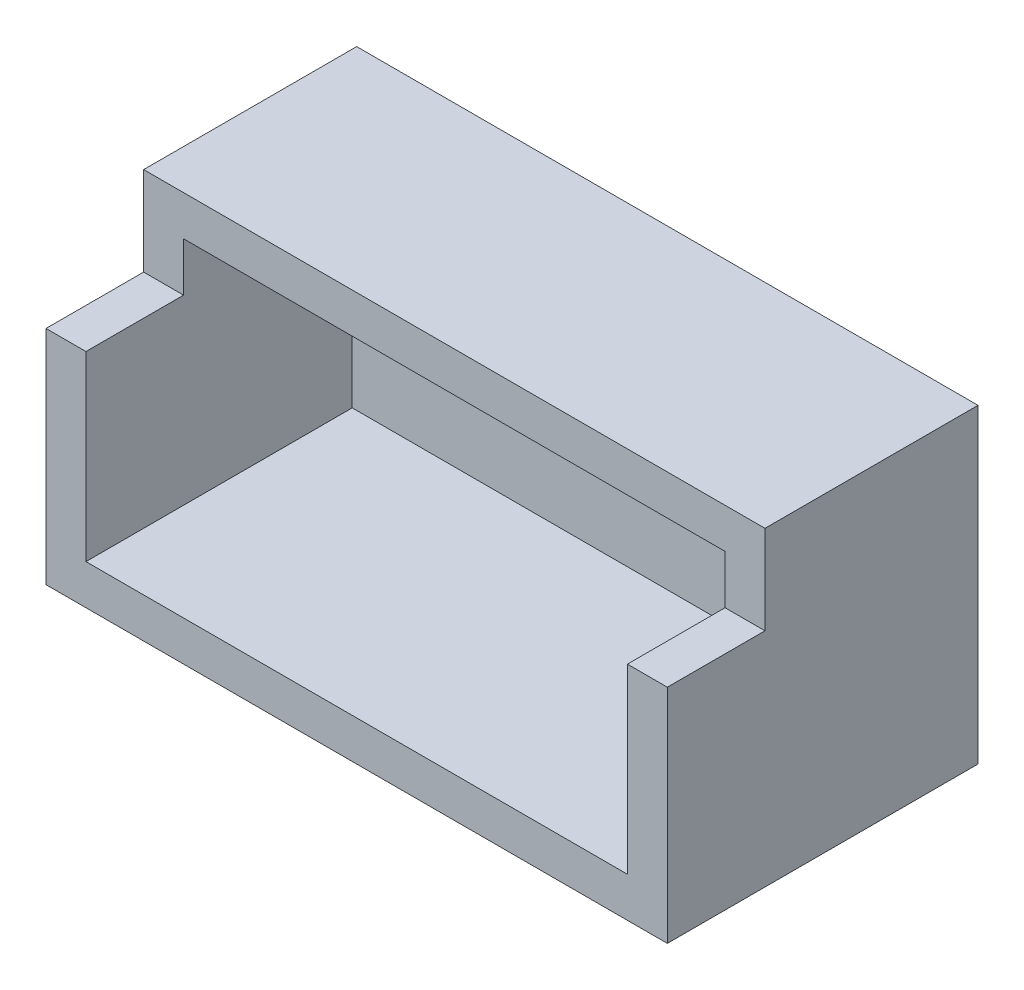
ISO-10303-21;
HEADER;
FILE_DESCRIPTION(('STEP AP214'),'2;1');
FILE_NAME('part.step','',(''),(''),'','','');
FILE_SCHEMA(('AUTOMOTIVE_DESIGN { 1 0 10303 214 1 1 1 1 }'));
ENDSEC;
DATA;
#1=APPLICATION_CONTEXT('core data for automotive mechanical design processes');
#2=APPLICATION_PROTOCOL_DEFINITION('international standard','automotive_design',2000,#1);
#3=PRODUCT_CONTEXT('',#1,'mechanical');
#4=PRODUCT('Part','Part','',(#3));
#5=PRODUCT_RELATED_PRODUCT_CATEGORY('part','',(#4));
#6=PRODUCT_DEFINITION_FORMATION('','',#4);
#7=PRODUCT_DEFINITION_CONTEXT('part definition',#1,'design');
#8=PRODUCT_DEFINITION('design','',#6,#7);
#9=PRODUCT_DEFINITION_SHAPE('','',#8);
#10=(LENGTH_UNIT() NAMED_UNIT(*) SI_UNIT(.MILLI.,.METRE.));
#11=(NAMED_UNIT(*) PLANE_ANGLE_UNIT() SI_UNIT($,.RADIAN.));
#12=(NAMED_UNIT(*) SI_UNIT($,.STERADIAN.) SOLID_ANGLE_UNIT());
#13=UNCERTAINTY_MEASURE_WITH_UNIT(LENGTH_MEASURE(1.E-05),#10,'distance_accuracy_value','');
#14=(GEOMETRIC_REPRESENTATION_CONTEXT(3) GLOBAL_UNCERTAINTY_ASSIGNED_CONTEXT((#13)) GLOBAL_UNIT_ASSIGNED_CONTEXT((#10,
#11,#12)) REPRESENTATION_CONTEXT('',''));
#15=CARTESIAN_POINT('',(0.,0.,0.));
#16=DIRECTION('',(0.,0.,1.));
#17=DIRECTION('',(1.,0.,0.));
#18=AXIS2_PLACEMENT_3D('',#15,#16,#17);
#19=CARTESIAN_POINT('',(0.,0.,6.));
#20=DIRECTION('',(0.,0.,-1.));
#21=DIRECTION('',(-1.,0.,0.));
#22=AXIS2_PLACEMENT_3D('',#19,#20,#21);
#23=PLANE('',#22);
#24=DIRECTION('',(1.,0.,0.));
#25=VECTOR('',#24,1.);
#26=CARTESIAN_POINT('',(0.,-16.,6.));
#27=LINE('',#26,#25);
#28=CARTESIAN_POINT('',(14.,-16.,6.));
#29=VERTEX_POINT('',#28);
#30=CARTESIAN_POINT('',(14.9,-16.,6.));
#31=VERTEX_POINT('',#30);
#32=EDGE_CURVE('E174',#29,#31,#27,.T.);
#33=ORIENTED_EDGE('',*,*,#32,.F.);
#34=DIRECTION('',(0.,-1.,0.));
#35=VECTOR('',#34,1.);
#36=CARTESIAN_POINT('',(14.,-21.,6.));
#37=LINE('',#36,#35);
#38=CARTESIAN_POINT('',(14.,-21.,6.));
#39=VERTEX_POINT('',#38);
#40=EDGE_CURVE('E109',#29,#39,#37,.T.);
#41=ORIENTED_EDGE('',*,*,#40,.T.);
#42=DIRECTION('',(1.,0.,0.));
#43=VECTOR('',#42,1.);
#44=CARTESIAN_POINT('',(14.,-21.,6.));
#45=LINE('',#44,#43);
#46=CARTESIAN_POINT('',(28.,-21.,6.));
#47=VERTEX_POINT('',#46);
#48=EDGE_CURVE('E68',#39,#47,#45,.T.);
#49=ORIENTED_EDGE('',*,*,#48,.T.);
#50=DIRECTION('',(0.,1.,0.));
#51=VECTOR('',#50,1.);
#52=CARTESIAN_POINT('',(28.,-21.,6.));
#53=LINE('',#52,#51);
#54=CARTESIAN_POINT('',(28.,-16.,6.));
#55=VERTEX_POINT('',#54);
#56=EDGE_CURVE('E101',#47,#55,#53,.T.);
#57=ORIENTED_EDGE('',*,*,#56,.T.);
#58=CARTESIAN_POINT('',(27.1,-16.,6.));
#59=VERTEX_POINT('',#58);
#60=EDGE_CURVE('E166',#59,#55,#27,.T.);
#61=ORIENTED_EDGE('',*,*,#60,.F.);
#62=DIRECTION('',(0.,1.,0.));
#63=VECTOR('',#62,1.);
#64=CARTESIAN_POINT('',(27.1,0.,6.));
#65=LINE('',#64,#63);
#66=CARTESIAN_POINT('',(27.1,-20.1,6.));
#67=VERTEX_POINT('',#66);
#68=EDGE_CURVE('E135',#67,#59,#65,.T.);
#69=ORIENTED_EDGE('',*,*,#68,.F.);
#70=DIRECTION('',(1.,0.,0.));
#71=VECTOR('',#70,1.);
#72=CARTESIAN_POINT('',(0.,-20.1,6.));
#73=LINE('',#72,#71);
#74=CARTESIAN_POINT('',(14.9,-20.1,6.));
#75=VERTEX_POINT('',#74);
#76=EDGE_CURVE('E133',#75,#67,#73,.T.);
#77=ORIENTED_EDGE('',*,*,#76,.F.);
#78=DIRECTION('',(0.,-1.,0.));
#79=VECTOR('',#78,1.);
#80=CARTESIAN_POINT('',(14.9,0.,6.));
#81=LINE('',#80,#79);
#82=EDGE_CURVE('E139',#31,#75,#81,.T.);
#83=ORIENTED_EDGE('',*,*,#82,.F.);
#84=EDGE_LOOP('',(#33,#41,#49,#57,#61,#69,#77,#83));
#85=FACE_BOUND('',#84,.T.);
#86=ADVANCED_FACE('F43',(#85),#23,.F.);
#87=CARTESIAN_POINT('',(14.,-21.,6.));
#88=DIRECTION('',(1.,0.,0.));
#89=DIRECTION('',(0.,0.,-1.));
#90=AXIS2_PLACEMENT_3D('',#87,#88,#89);
#91=PLANE('',#90);
#92=DIRECTION('',(0.,0.,1.));
#93=VECTOR('',#92,1.);
#94=CARTESIAN_POINT('',(14.,-16.,6.));
#95=LINE('',#94,#93);
#96=CARTESIAN_POINT('',(14.,-16.,3.8));
#97=VERTEX_POINT('',#96);
#98=EDGE_CURVE('E178',#97,#29,#95,.T.);
#99=ORIENTED_EDGE('',*,*,#98,.F.);
#100=DIRECTION('',(0.,1.,0.));
#101=VECTOR('',#100,1.);
#102=CARTESIAN_POINT('',(14.,-21.,3.8));
#103=LINE('',#102,#101);
#104=CARTESIAN_POINT('',(14.,-14.,3.8));
#105=VERTEX_POINT('',#104);
#106=EDGE_CURVE('E100',#97,#105,#103,.T.);
#107=ORIENTED_EDGE('',*,*,#106,.T.);
#108=DIRECTION('',(0.,0.,-1.));
#109=VECTOR('',#108,1.);
#110=CARTESIAN_POINT('',(14.,-14.,6.));
#111=LINE('',#110,#109);
#112=CARTESIAN_POINT('',(14.,-14.,-1.));
#113=VERTEX_POINT('',#112);
#114=EDGE_CURVE('E90',#105,#113,#111,.T.);
#115=ORIENTED_EDGE('',*,*,#114,.T.);
#116=DIRECTION('',(0.,-1.,0.));
#117=VECTOR('',#116,1.);
#118=CARTESIAN_POINT('',(14.,-21.,-1.));
#119=LINE('',#118,#117);
#120=CARTESIAN_POINT('',(14.,-21.,-1.));
#121=VERTEX_POINT('',#120);
#122=EDGE_CURVE('E94',#113,#121,#119,.T.);
#123=ORIENTED_EDGE('',*,*,#122,.T.);
#124=DIRECTION('',(0.,0.,-1.));
#125=VECTOR('',#124,1.);
#126=CARTESIAN_POINT('',(14.,-21.,6.));
#127=LINE('',#126,#125);
#128=EDGE_CURVE('E128',#39,#121,#127,.T.);
#129=ORIENTED_EDGE('',*,*,#128,.F.);
#130=ORIENTED_EDGE('',*,*,#40,.F.);
#131=EDGE_LOOP('',(#99,#107,#115,#123,#129,#130));
#132=FACE_BOUND('',#131,.T.);
#133=ADVANCED_FACE('F44',(#132),#91,.F.);
#134=CARTESIAN_POINT('',(28.,-21.,6.));
#135=DIRECTION('',(-1.,0.,0.));
#136=DIRECTION('',(0.,0.,1.));
#137=AXIS2_PLACEMENT_3D('',#134,#135,#136);
#138=PLANE('',#137);
#139=DIRECTION('',(0.,0.,-1.));
#140=VECTOR('',#139,1.);
#141=CARTESIAN_POINT('',(28.,-16.,6.));
#142=LINE('',#141,#140);
#143=CARTESIAN_POINT('',(28.,-16.,3.8));
#144=VERTEX_POINT('',#143);
#145=EDGE_CURVE('E175',#55,#144,#142,.T.);
#146=ORIENTED_EDGE('',*,*,#145,.F.);
#147=ORIENTED_EDGE('',*,*,#56,.F.);
#148=DIRECTION('',(0.,0.,-1.));
#149=VECTOR('',#148,1.);
#150=CARTESIAN_POINT('',(28.,-21.,6.));
#151=LINE('',#150,#149);
#152=CARTESIAN_POINT('',(28.,-21.,-1.));
#153=VERTEX_POINT('',#152);
#154=EDGE_CURVE('E130',#47,#153,#151,.T.);
#155=ORIENTED_EDGE('',*,*,#154,.T.);
#156=DIRECTION('',(0.,1.,0.));
#157=VECTOR('',#156,1.);
#158=CARTESIAN_POINT('',(28.,-21.,-1.));
#159=LINE('',#158,#157);
#160=CARTESIAN_POINT('',(28.,-14.,-1.));
#161=VERTEX_POINT('',#160);
#162=EDGE_CURVE('E112',#153,#161,#159,.T.);
#163=ORIENTED_EDGE('',*,*,#162,.T.);
#164=DIRECTION('',(0.,0.,-1.));
#165=VECTOR('',#164,1.);
#166=CARTESIAN_POINT('',(28.,-14.,6.));
#167=LINE('',#166,#165);
#168=CARTESIAN_POINT('',(28.,-14.,3.8));
#169=VERTEX_POINT('',#168);
#170=EDGE_CURVE('E99',#169,#161,#167,.T.);
#171=ORIENTED_EDGE('',*,*,#170,.F.);
#172=DIRECTION('',(0.,-1.,0.));
#173=VECTOR('',#172,1.);
#174=CARTESIAN_POINT('',(28.,-21.,3.8));
#175=LINE('',#174,#173);
#176=EDGE_CURVE('E164',#169,#144,#175,.T.);
#177=ORIENTED_EDGE('',*,*,#176,.T.);
#178=EDGE_LOOP('',(#146,#147,#155,#163,#171,#177));
#179=FACE_BOUND('',#178,.T.);
#180=ADVANCED_FACE('F215',(#179),#138,.F.);
#181=CARTESIAN_POINT('',(14.9,-20.1,7.));
#182=DIRECTION('',(1.,0.,0.));
#183=DIRECTION('',(0.,0.,-1.));
#184=AXIS2_PLACEMENT_3D('',#181,#182,#183);
#185=PLANE('',#184);
#186=DIRECTION('',(0.,1.,0.));
#187=VECTOR('',#186,1.);
#188=CARTESIAN_POINT('',(14.9,-20.1,3.8));
#189=LINE('',#188,#187);
#190=CARTESIAN_POINT('',(14.9,-16.,3.8));
#191=VERTEX_POINT('',#190);
#192=CARTESIAN_POINT('',(14.9,-14.9,3.8));
#193=VERTEX_POINT('',#192);
#194=EDGE_CURVE('E58',#191,#193,#189,.T.);
#195=ORIENTED_EDGE('',*,*,#194,.F.);
#196=DIRECTION('',(0.,0.,1.));
#197=VECTOR('',#196,1.);
#198=CARTESIAN_POINT('',(14.9,-16.,7.));
#199=LINE('',#198,#197);
#200=EDGE_CURVE('E176',#191,#31,#199,.T.);
#201=ORIENTED_EDGE('',*,*,#200,.T.);
#202=ORIENTED_EDGE('',*,*,#82,.T.);
#203=DIRECTION('',(0.,0.,-1.));
#204=VECTOR('',#203,1.);
#205=CARTESIAN_POINT('',(14.9,-20.1,7.));
#206=LINE('',#205,#204);
#207=CARTESIAN_POINT('',(14.9,-20.1,0.));
#208=VERTEX_POINT('',#207);
#209=EDGE_CURVE('E117',#75,#208,#206,.T.);
#210=ORIENTED_EDGE('',*,*,#209,.T.);
#211=DIRECTION('',(0.,-1.,0.));
#212=VECTOR('',#211,1.);
#213=CARTESIAN_POINT('',(14.9,-20.1,0.));
#214=LINE('',#213,#212);
#215=CARTESIAN_POINT('',(14.9,-14.9,0.));
#216=VERTEX_POINT('',#215);
#217=EDGE_CURVE('E185',#216,#208,#214,.T.);
#218=ORIENTED_EDGE('',*,*,#217,.F.);
#219=DIRECTION('',(0.,0.,-1.));
#220=VECTOR('',#219,1.);
#221=CARTESIAN_POINT('',(14.9,-14.9,7.));
#222=LINE('',#221,#220);
#223=EDGE_CURVE('E193',#193,#216,#222,.T.);
#224=ORIENTED_EDGE('',*,*,#223,.F.);
#225=EDGE_LOOP('',(#195,#201,#202,#210,#218,#224));
#226=FACE_BOUND('',#225,.T.);
#227=ADVANCED_FACE('F249',(#226),#185,.T.);
#228=CARTESIAN_POINT('',(27.1,-20.1,7.));
#229=DIRECTION('',(-1.,0.,0.));
#230=DIRECTION('',(0.,0.,1.));
#231=AXIS2_PLACEMENT_3D('',#228,#229,#230);
#232=PLANE('',#231);
#233=ORIENTED_EDGE('',*,*,#68,.T.);
#234=DIRECTION('',(0.,0.,-1.));
#235=VECTOR('',#234,1.);
#236=CARTESIAN_POINT('',(27.1,-16.,7.));
#237=LINE('',#236,#235);
#238=CARTESIAN_POINT('',(27.1,-16.,3.8));
#239=VERTEX_POINT('',#238);
#240=EDGE_CURVE('E11',#59,#239,#237,.T.);
#241=ORIENTED_EDGE('',*,*,#240,.T.);
#242=DIRECTION('',(0.,-1.,0.));
#243=VECTOR('',#242,1.);
#244=CARTESIAN_POINT('',(27.1,-20.1,3.8));
#245=LINE('',#244,#243);
#246=CARTESIAN_POINT('',(27.1,-14.9,3.8));
#247=VERTEX_POINT('',#246);
#248=EDGE_CURVE('E157',#247,#239,#245,.T.);
#249=ORIENTED_EDGE('',*,*,#248,.F.);
#250=DIRECTION('',(0.,0.,-1.));
#251=VECTOR('',#250,1.);
#252=CARTESIAN_POINT('',(27.1,-14.9,7.));
#253=LINE('',#252,#251);
#254=CARTESIAN_POINT('',(27.1,-14.9,0.));
#255=VERTEX_POINT('',#254);
#256=EDGE_CURVE('E197',#247,#255,#253,.T.);
#257=ORIENTED_EDGE('',*,*,#256,.T.);
#258=DIRECTION('',(0.,1.,0.));
#259=VECTOR('',#258,1.);
#260=CARTESIAN_POINT('',(27.1,-20.1,0.));
#261=LINE('',#260,#259);
#262=CARTESIAN_POINT('',(27.1,-20.1,0.));
#263=VERTEX_POINT('',#262);
#264=EDGE_CURVE('E189',#263,#255,#261,.T.);
#265=ORIENTED_EDGE('',*,*,#264,.F.);
#266=DIRECTION('',(0.,0.,-1.));
#267=VECTOR('',#266,1.);
#268=CARTESIAN_POINT('',(27.1,-20.1,7.));
#269=LINE('',#268,#267);
#270=EDGE_CURVE('E118',#67,#263,#269,.T.);
#271=ORIENTED_EDGE('',*,*,#270,.F.);
#272=EDGE_LOOP('',(#233,#241,#249,#257,#265,#271));
#273=FACE_BOUND('',#272,.T.);
#274=ADVANCED_FACE('F228',(#273),#232,.T.);
#275=CARTESIAN_POINT('',(14.,-21.,6.));
#276=DIRECTION('',(0.,1.,0.));
#277=DIRECTION('',(0.,0.,1.));
#278=AXIS2_PLACEMENT_3D('',#275,#276,#277);
#279=PLANE('',#278);
#280=DIRECTION('',(1.,0.,0.));
#281=VECTOR('',#280,1.);
#282=CARTESIAN_POINT('',(14.,-21.,-1.));
#283=LINE('',#282,#281);
#284=EDGE_CURVE('E111',#121,#153,#283,.T.);
#285=ORIENTED_EDGE('',*,*,#284,.T.);
#286=ORIENTED_EDGE('',*,*,#154,.F.);
#287=ORIENTED_EDGE('',*,*,#48,.F.);
#288=ORIENTED_EDGE('',*,*,#128,.T.);
#289=EDGE_LOOP('',(#285,#286,#287,#288));
#290=FACE_BOUND('',#289,.T.);
#291=ADVANCED_FACE('F274',(#290),#279,.F.);
#292=CARTESIAN_POINT('',(14.,-14.,6.));
#293=DIRECTION('',(0.,-1.,0.));
#294=DIRECTION('',(0.,0.,-1.));
#295=AXIS2_PLACEMENT_3D('',#292,#293,#294);
#296=PLANE('',#295);
#297=ORIENTED_EDGE('',*,*,#114,.F.);
#298=DIRECTION('',(1.,0.,0.));
#299=VECTOR('',#298,1.);
#300=CARTESIAN_POINT('',(14.,-14.,3.8));
#301=LINE('',#300,#299);
#302=EDGE_CURVE('E162',#105,#169,#301,.T.);
#303=ORIENTED_EDGE('',*,*,#302,.T.);
#304=ORIENTED_EDGE('',*,*,#170,.T.);
#305=DIRECTION('',(-1.,0.,0.));
#306=VECTOR('',#305,1.);
#307=CARTESIAN_POINT('',(14.,-14.,-1.));
#308=LINE('',#307,#306);
#309=EDGE_CURVE('E102',#161,#113,#308,.T.);
#310=ORIENTED_EDGE('',*,*,#309,.T.);
#311=EDGE_LOOP('',(#297,#303,#304,#310));
#312=FACE_BOUND('',#311,.T.);
#313=ADVANCED_FACE('F104',(#312),#296,.F.);
#314=CARTESIAN_POINT('',(0.,0.,-1.));
#315=DIRECTION('',(0.,0.,-1.));
#316=DIRECTION('',(-1.,0.,0.));
#317=AXIS2_PLACEMENT_3D('',#314,#315,#316);
#318=PLANE('',#317);
#319=CARTESIAN_POINT('',(18.,-17.5,-1.));
#320=DIRECTION('',(0.,0.,-1.));
#321=DIRECTION('',(-1.,0.,0.));
#322=AXIS2_PLACEMENT_3D('',#319,#320,#321);
#323=CIRCLE('',#322,1.1);
#324=CARTESIAN_POINT('',(16.9,-17.5,-1.));
#325=VERTEX_POINT('',#324);
#326=EDGE_CURVE('E151',#325,#325,#323,.F.);
#327=ORIENTED_EDGE('',*,*,#326,.T.);
#328=EDGE_LOOP('',(#327));
#329=FACE_BOUND('',#328,.T.);
#330=CARTESIAN_POINT('',(24.,-17.5,-1.));
#331=DIRECTION('',(0.,0.,-1.));
#332=DIRECTION('',(-1.,0.,0.));
#333=AXIS2_PLACEMENT_3D('',#330,#331,#332);
#334=CIRCLE('',#333,1.1);
#335=CARTESIAN_POINT('',(22.9,-17.5,-1.));
#336=VERTEX_POINT('',#335);
#337=EDGE_CURVE('E141',#336,#336,#334,.F.);
#338=ORIENTED_EDGE('',*,*,#337,.T.);
#339=EDGE_LOOP('',(#338));
#340=FACE_BOUND('',#339,.T.);
#341=ORIENTED_EDGE('',*,*,#122,.F.);
#342=ORIENTED_EDGE('',*,*,#309,.F.);
#343=ORIENTED_EDGE('',*,*,#162,.F.);
#344=ORIENTED_EDGE('',*,*,#284,.F.);
#345=EDGE_LOOP('',(#341,#342,#343,#344));
#346=FACE_BOUND('',#345,.T.);
#347=ADVANCED_FACE('F114',(#329,#340,#346),#318,.T.);
#348=CARTESIAN_POINT('',(14.9,-20.1,7.));
#349=DIRECTION('',(0.,1.,0.));
#350=DIRECTION('',(0.,0.,1.));
#351=AXIS2_PLACEMENT_3D('',#348,#349,#350);
#352=PLANE('',#351);
#353=ORIENTED_EDGE('',*,*,#76,.T.);
#354=ORIENTED_EDGE('',*,*,#270,.T.);
#355=DIRECTION('',(1.,0.,0.));
#356=VECTOR('',#355,1.);
#357=CARTESIAN_POINT('',(14.9,-20.1,0.));
#358=LINE('',#357,#356);
#359=EDGE_CURVE('E183',#208,#263,#358,.T.);
#360=ORIENTED_EDGE('',*,*,#359,.F.);
#361=ORIENTED_EDGE('',*,*,#209,.F.);
#362=EDGE_LOOP('',(#353,#354,#360,#361));
#363=FACE_BOUND('',#362,.T.);
#364=ADVANCED_FACE('F258',(#363),#352,.T.);
#365=CARTESIAN_POINT('',(14.9,-14.9,7.));
#366=DIRECTION('',(0.,-1.,0.));
#367=DIRECTION('',(0.,0.,-1.));
#368=AXIS2_PLACEMENT_3D('',#365,#366,#367);
#369=PLANE('',#368);
#370=DIRECTION('',(1.,0.,0.));
#371=VECTOR('',#370,1.);
#372=CARTESIAN_POINT('',(14.9,-14.9,3.8));
#373=LINE('',#372,#371);
#374=EDGE_CURVE('E55',#193,#247,#373,.T.);
#375=ORIENTED_EDGE('',*,*,#374,.F.);
#376=ORIENTED_EDGE('',*,*,#223,.T.);
#377=DIRECTION('',(-1.,0.,0.));
#378=VECTOR('',#377,1.);
#379=CARTESIAN_POINT('',(14.9,-14.9,0.));
#380=LINE('',#379,#378);
#381=EDGE_CURVE('E191',#255,#216,#380,.T.);
#382=ORIENTED_EDGE('',*,*,#381,.F.);
#383=ORIENTED_EDGE('',*,*,#256,.F.);
#384=EDGE_LOOP('',(#375,#376,#382,#383));
#385=FACE_BOUND('',#384,.T.);
#386=ADVANCED_FACE('F237',(#385),#369,.T.);
#387=CARTESIAN_POINT('',(0.,0.,0.));
#388=DIRECTION('',(0.,0.,-1.));
#389=DIRECTION('',(-1.,0.,0.));
#390=AXIS2_PLACEMENT_3D('',#387,#388,#389);
#391=PLANE('',#390);
#392=CARTESIAN_POINT('',(18.,-17.5,0.));
#393=DIRECTION('',(0.,0.,-1.));
#394=DIRECTION('',(-1.,0.,0.));
#395=AXIS2_PLACEMENT_3D('',#392,#393,#394);
#396=CIRCLE('',#395,1.1);
#397=CARTESIAN_POINT('',(16.9,-17.5,0.));
#398=VERTEX_POINT('',#397);
#399=EDGE_CURVE('E50',#398,#398,#396,.F.);
#400=ORIENTED_EDGE('',*,*,#399,.F.);
#401=EDGE_LOOP('',(#400));
#402=FACE_BOUND('',#401,.T.);
#403=CARTESIAN_POINT('',(24.,-17.5,0.));
#404=DIRECTION('',(0.,0.,-1.));
#405=DIRECTION('',(-1.,0.,0.));
#406=AXIS2_PLACEMENT_3D('',#403,#404,#405);
#407=CIRCLE('',#406,1.1);
#408=CARTESIAN_POINT('',(22.9,-17.5,0.));
#409=VERTEX_POINT('',#408);
#410=EDGE_CURVE('E143',#409,#409,#407,.F.);
#411=ORIENTED_EDGE('',*,*,#410,.F.);
#412=EDGE_LOOP('',(#411));
#413=FACE_BOUND('',#412,.T.);
#414=ORIENTED_EDGE('',*,*,#217,.T.);
#415=ORIENTED_EDGE('',*,*,#359,.T.);
#416=ORIENTED_EDGE('',*,*,#264,.T.);
#417=ORIENTED_EDGE('',*,*,#381,.T.);
#418=EDGE_LOOP('',(#414,#415,#416,#417));
#419=FACE_BOUND('',#418,.T.);
#420=ADVANCED_FACE('F244',(#402,#413,#419),#391,.F.);
#421=CARTESIAN_POINT('',(13.,-16.,7.));
#422=DIRECTION('',(0.,1.,0.));
#423=DIRECTION('',(0.,0.,1.));
#424=AXIS2_PLACEMENT_3D('',#421,#422,#423);
#425=PLANE('',#424);
#426=ORIENTED_EDGE('',*,*,#98,.T.);
#427=ORIENTED_EDGE('',*,*,#32,.T.);
#428=ORIENTED_EDGE('',*,*,#200,.F.);
#429=DIRECTION('',(1.,0.,0.));
#430=VECTOR('',#429,1.);
#431=CARTESIAN_POINT('',(13.,-16.,3.8));
#432=LINE('',#431,#430);
#433=EDGE_CURVE('E158',#97,#191,#432,.T.);
#434=ORIENTED_EDGE('',*,*,#433,.F.);
#435=EDGE_LOOP('',(#426,#427,#428,#434));
#436=FACE_BOUND('',#435,.T.);
#437=ADVANCED_FACE('F275',(#436),#425,.T.);
#438=ORIENTED_EDGE('',*,*,#145,.T.);
#439=EDGE_CURVE('E154',#239,#144,#432,.T.);
#440=ORIENTED_EDGE('',*,*,#439,.F.);
#441=ORIENTED_EDGE('',*,*,#240,.F.);
#442=ORIENTED_EDGE('',*,*,#60,.T.);
#443=EDGE_LOOP('',(#438,#440,#441,#442));
#444=FACE_BOUND('',#443,.T.);
#445=ADVANCED_FACE('F220',(#444),#425,.T.);
#446=CARTESIAN_POINT('',(0.,0.,3.8));
#447=DIRECTION('',(0.,0.,-1.));
#448=DIRECTION('',(-1.,0.,0.));
#449=AXIS2_PLACEMENT_3D('',#446,#447,#448);
#450=PLANE('',#449);
#451=ORIENTED_EDGE('',*,*,#433,.T.);
#452=ORIENTED_EDGE('',*,*,#194,.T.);
#453=ORIENTED_EDGE('',*,*,#374,.T.);
#454=ORIENTED_EDGE('',*,*,#248,.T.);
#455=ORIENTED_EDGE('',*,*,#439,.T.);
#456=ORIENTED_EDGE('',*,*,#176,.F.);
#457=ORIENTED_EDGE('',*,*,#302,.F.);
#458=ORIENTED_EDGE('',*,*,#106,.F.);
#459=EDGE_LOOP('',(#451,#452,#453,#454,#455,#456,#457,#458));
#460=FACE_BOUND('',#459,.T.);
#461=ADVANCED_FACE('F225',(#460),#450,.F.);
#462=CARTESIAN_POINT('',(24.,-17.5,6.));
#463=DIRECTION('',(0.,0.,-1.));
#464=DIRECTION('',(-1.,0.,0.));
#465=AXIS2_PLACEMENT_3D('',#462,#463,#464);
#466=CYLINDRICAL_SURFACE('',#465,1.1);
#467=ORIENTED_EDGE('',*,*,#337,.F.);
#468=EDGE_LOOP('',(#467));
#469=FACE_BOUND('',#468,.T.);
#470=ORIENTED_EDGE('',*,*,#410,.T.);
#471=EDGE_LOOP('',(#470));
#472=FACE_BOUND('',#471,.T.);
#473=ADVANCED_FACE('F336',(#469,#472),#466,.F.);
#474=CARTESIAN_POINT('',(18.,-17.5,6.));
#475=DIRECTION('',(0.,0.,-1.));
#476=DIRECTION('',(-1.,0.,0.));
#477=AXIS2_PLACEMENT_3D('',#474,#475,#476);
#478=CYLINDRICAL_SURFACE('',#477,1.1);
#479=ORIENTED_EDGE('',*,*,#326,.F.);
#480=EDGE_LOOP('',(#479));
#481=FACE_BOUND('',#480,.T.);
#482=ORIENTED_EDGE('',*,*,#399,.T.);
#483=EDGE_LOOP('',(#482));
#484=FACE_BOUND('',#483,.T.);
#485=ADVANCED_FACE('F359',(#481,#484),#478,.F.);
#486=CLOSED_SHELL('',(#86,#133,#180,#227,#274,#291,#313,#347,#364,#386,#420,#437,#445,#461,#473,#485));
#487=MANIFOLD_SOLID_BREP('B2',#486);
#488=ADVANCED_BREP_SHAPE_REPRESENTATION('',(#18,#487),#14);
#489=SHAPE_DEFINITION_REPRESENTATION(#9,#488);
ENDSEC;
END-ISO-10303-21;
